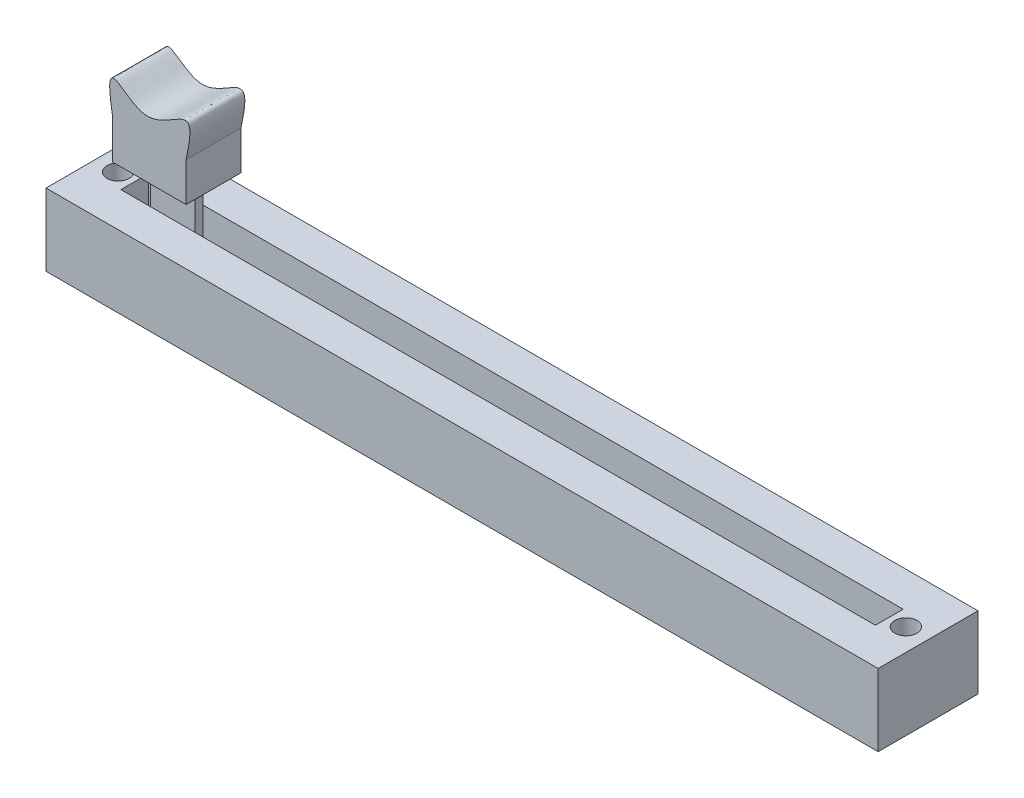
ISO-10303-21;
HEADER;
FILE_DESCRIPTION(('STEP AP214'),'2;1');
FILE_NAME('part.step','',(''),(''),'','','');
FILE_SCHEMA(('AUTOMOTIVE_DESIGN { 1 0 10303 214 1 1 1 1 }'));
ENDSEC;
DATA;
#1=APPLICATION_CONTEXT('core data for automotive mechanical design processes');
#2=APPLICATION_PROTOCOL_DEFINITION('international standard','automotive_design',2000,#1);
#3=PRODUCT_CONTEXT('',#1,'mechanical');
#4=PRODUCT('Part','Part','',(#3));
#5=PRODUCT_RELATED_PRODUCT_CATEGORY('part','',(#4));
#6=PRODUCT_DEFINITION_FORMATION('','',#4);
#7=PRODUCT_DEFINITION_CONTEXT('part definition',#1,'design');
#8=PRODUCT_DEFINITION('design','',#6,#7);
#9=PRODUCT_DEFINITION_SHAPE('','',#8);
#10=(LENGTH_UNIT() NAMED_UNIT(*) SI_UNIT(.MILLI.,.METRE.));
#11=(NAMED_UNIT(*) PLANE_ANGLE_UNIT() SI_UNIT($,.RADIAN.));
#12=(NAMED_UNIT(*) SI_UNIT($,.STERADIAN.) SOLID_ANGLE_UNIT());
#13=UNCERTAINTY_MEASURE_WITH_UNIT(LENGTH_MEASURE(1.E-05),#10,'distance_accuracy_value','');
#14=(GEOMETRIC_REPRESENTATION_CONTEXT(3) GLOBAL_UNCERTAINTY_ASSIGNED_CONTEXT((#13)) GLOBAL_UNIT_ASSIGNED_CONTEXT((#10,
#11,#12)) REPRESENTATION_CONTEXT('',''));
#15=CARTESIAN_POINT('',(0.,0.,0.));
#16=DIRECTION('',(0.,0.,1.));
#17=DIRECTION('',(1.,0.,0.));
#18=AXIS2_PLACEMENT_3D('',#15,#16,#17);
#19=CARTESIAN_POINT('',(-33.5207521696573,9.5,0.));
#20=DIRECTION('',(1.,0.,0.));
#21=DIRECTION('',(0.,0.,-1.));
#22=AXIS2_PLACEMENT_3D('',#19,#20,#21);
#23=PLANE('',#22);
#24=DIRECTION('',(0.,1.,0.));
#25=VECTOR('',#24,1.);
#26=CARTESIAN_POINT('',(-33.5207521696573,9.5,2.47426588466461));
#27=LINE('',#26,#25);
#28=CARTESIAN_POINT('',(-33.5207521696573,9.5,2.47426588466461));
#29=VERTEX_POINT('',#28);
#30=CARTESIAN_POINT('',(-33.5207521696573,13.,2.47426588466461));
#31=VERTEX_POINT('',#30);
#32=EDGE_CURVE('E13',#29,#31,#27,.T.);
#33=ORIENTED_EDGE('',*,*,#32,.T.);
#34=DIRECTION('',(0.,0.,-1.));
#35=VECTOR('',#34,1.);
#36=CARTESIAN_POINT('',(-33.5207521696573,13.,0.));
#37=LINE('',#36,#35);
#38=CARTESIAN_POINT('',(-33.5207521696573,13.,-2.47426588466461));
#39=VERTEX_POINT('',#38);
#40=EDGE_CURVE('E140',#31,#39,#37,.T.);
#41=ORIENTED_EDGE('',*,*,#40,.T.);
#42=DIRECTION('',(0.,1.,0.));
#43=VECTOR('',#42,1.);
#44=CARTESIAN_POINT('',(-33.5207521696573,9.5,-2.47426588466461));
#45=LINE('',#44,#43);
#46=CARTESIAN_POINT('',(-33.5207521696573,9.5,-2.47426588466461));
#47=VERTEX_POINT('',#46);
#48=EDGE_CURVE('E106',#47,#39,#45,.T.);
#49=ORIENTED_EDGE('',*,*,#48,.F.);
#50=DIRECTION('',(0.,0.,-1.));
#51=VECTOR('',#50,1.);
#52=CARTESIAN_POINT('',(-33.5207521696573,9.5,0.));
#53=LINE('',#52,#51);
#54=EDGE_CURVE('E153',#29,#47,#53,.T.);
#55=ORIENTED_EDGE('',*,*,#54,.F.);
#56=EDGE_LOOP('',(#33,#41,#49,#55));
#57=FACE_BOUND('',#56,.T.);
#58=ADVANCED_FACE('F97',(#57),#23,.F.);
#59=CARTESIAN_POINT('',(0.,9.5,-2.47426588466461));
#60=DIRECTION('',(0.,0.,1.));
#61=DIRECTION('',(1.,0.,0.));
#62=AXIS2_PLACEMENT_3D('',#59,#60,#61);
#63=PLANE('',#62);
#64=ORIENTED_EDGE('',*,*,#48,.T.);
#65=CARTESIAN_POINT('',(-26.8995090885313,13.,-2.47426588466461));
#66=CARTESIAN_POINT('',(-25.6043212619655,18.7745663821567,-2.47426588466461));
#67=CARTESIAN_POINT('',(-30.5232119514642,10.6110358243155,-2.47426588466461));
#68=CARTESIAN_POINT('',(-34.4964256333982,18.6414033601117,-2.47426588466461));
#69=CARTESIAN_POINT('',(-33.5207521696573,13.,-2.47426588466461));
#70=B_SPLINE_CURVE_WITH_KNOTS('',3,(#65,#66,#67,#68,#69),.UNSPECIFIED.,.F.,.F.,(4,1,4),(0.,
0.526384960024417,1.),.UNSPECIFIED.);
#71=CARTESIAN_POINT('',(-26.8995090885313,13.,-2.47426588466461));
#72=VERTEX_POINT('',#71);
#73=EDGE_CURVE('E145',#39,#72,#70,.F.);
#74=ORIENTED_EDGE('',*,*,#73,.T.);
#75=DIRECTION('',(0.,1.,0.));
#76=VECTOR('',#75,1.);
#77=CARTESIAN_POINT('',(-26.8995090885313,9.5,-2.47426588466461));
#78=LINE('',#77,#76);
#79=CARTESIAN_POINT('',(-26.8995090885313,9.5,-2.47426588466461));
#80=VERTEX_POINT('',#79);
#81=EDGE_CURVE('E166',#80,#72,#78,.T.);
#82=ORIENTED_EDGE('',*,*,#81,.F.);
#83=DIRECTION('',(1.,0.,0.));
#84=VECTOR('',#83,1.);
#85=CARTESIAN_POINT('',(0.,9.5,-2.47426588466461));
#86=LINE('',#85,#84);
#87=EDGE_CURVE('E120',#47,#80,#86,.T.);
#88=ORIENTED_EDGE('',*,*,#87,.F.);
#89=EDGE_LOOP('',(#64,#74,#82,#88));
#90=FACE_BOUND('',#89,.T.);
#91=ADVANCED_FACE('F170',(#90),#63,.F.);
#92=CARTESIAN_POINT('',(-26.8995090885313,9.5,0.));
#93=DIRECTION('',(1.,0.,0.));
#94=DIRECTION('',(0.,0.,-1.));
#95=AXIS2_PLACEMENT_3D('',#92,#93,#94);
#96=PLANE('',#95);
#97=ORIENTED_EDGE('',*,*,#81,.T.);
#98=DIRECTION('',(0.,0.,-1.));
#99=VECTOR('',#98,1.);
#100=CARTESIAN_POINT('',(-26.8995090885313,13.,0.));
#101=LINE('',#100,#99);
#102=CARTESIAN_POINT('',(-26.8995090885313,13.,2.47426588466461));
#103=VERTEX_POINT('',#102);
#104=EDGE_CURVE('E149',#103,#72,#101,.T.);
#105=ORIENTED_EDGE('',*,*,#104,.F.);
#106=DIRECTION('',(0.,1.,0.));
#107=VECTOR('',#106,1.);
#108=CARTESIAN_POINT('',(-26.8995090885313,9.5,2.47426588466461));
#109=LINE('',#108,#107);
#110=CARTESIAN_POINT('',(-26.8995090885313,9.5,2.47426588466461));
#111=VERTEX_POINT('',#110);
#112=EDGE_CURVE('E101',#111,#103,#109,.T.);
#113=ORIENTED_EDGE('',*,*,#112,.F.);
#114=DIRECTION('',(0.,0.,-1.));
#115=VECTOR('',#114,1.);
#116=CARTESIAN_POINT('',(-26.8995090885313,9.5,0.));
#117=LINE('',#116,#115);
#118=EDGE_CURVE('E160',#111,#80,#117,.T.);
#119=ORIENTED_EDGE('',*,*,#118,.T.);
#120=EDGE_LOOP('',(#97,#105,#113,#119));
#121=FACE_BOUND('',#120,.T.);
#122=ADVANCED_FACE('F169',(#121),#96,.T.);
#123=CARTESIAN_POINT('',(0.,9.5,2.47426588466461));
#124=DIRECTION('',(0.,0.,1.));
#125=DIRECTION('',(1.,0.,0.));
#126=AXIS2_PLACEMENT_3D('',#123,#124,#125);
#127=PLANE('',#126);
#128=ORIENTED_EDGE('',*,*,#112,.T.);
#129=CARTESIAN_POINT('',(-26.8995090885313,13.,2.47426588466461));
#130=CARTESIAN_POINT('',(-25.6043212619655,18.7745663821567,2.47426588466461));
#131=CARTESIAN_POINT('',(-30.5232119514642,10.6110358243155,2.47426588466461));
#132=CARTESIAN_POINT('',(-34.4964256333982,18.6414033601117,2.47426588466461));
#133=CARTESIAN_POINT('',(-33.5207521696573,13.,2.47426588466461));
#134=B_SPLINE_CURVE_WITH_KNOTS('',3,(#129,#130,#131,#132,#133),.UNSPECIFIED.,.F.,.F.,(4,1,4),
(0.,0.526384960024417,1.),.UNSPECIFIED.);
#135=EDGE_CURVE('E142',#103,#31,#134,.T.);
#136=ORIENTED_EDGE('',*,*,#135,.T.);
#137=ORIENTED_EDGE('',*,*,#32,.F.);
#138=DIRECTION('',(1.,0.,0.));
#139=VECTOR('',#138,1.);
#140=CARTESIAN_POINT('',(0.,9.5,2.47426588466461));
#141=LINE('',#140,#139);
#142=EDGE_CURVE('E148',#29,#111,#141,.T.);
#143=ORIENTED_EDGE('',*,*,#142,.T.);
#144=EDGE_LOOP('',(#128,#136,#137,#143));
#145=FACE_BOUND('',#144,.T.);
#146=ADVANCED_FACE('F99',(#145),#127,.T.);
#147=CARTESIAN_POINT('',(0.,9.5,0.));
#148=DIRECTION('',(0.,1.,0.));
#149=DIRECTION('',(0.,0.,1.));
#150=AXIS2_PLACEMENT_3D('',#147,#148,#149);
#151=PLANE('',#150);
#152=ORIENTED_EDGE('',*,*,#142,.F.);
#153=ORIENTED_EDGE('',*,*,#54,.T.);
#154=ORIENTED_EDGE('',*,*,#87,.T.);
#155=ORIENTED_EDGE('',*,*,#118,.F.);
#156=EDGE_LOOP('',(#152,#153,#154,#155));
#157=FACE_BOUND('',#156,.T.);
#158=ADVANCED_FACE('F158',(#157),#151,.F.);
#159=CARTESIAN_POINT('',(-26.8995090885313,13.,-12.7765696506724));
#160=CARTESIAN_POINT('',(-25.6043212619655,18.7745663821567,-12.7765696506724));
#161=CARTESIAN_POINT('',(-30.5232119514642,10.6110358243155,-12.7765696506724));
#162=CARTESIAN_POINT('',(-34.4964256333982,18.6414033601117,-12.7765696506724));
#163=CARTESIAN_POINT('',(-33.5207521696573,13.,-12.7765696506724));
#164=B_SPLINE_CURVE_WITH_KNOTS('',3,(#159,#160,#161,#162,#163),.UNSPECIFIED.,.F.,.F.,(4,1,4),
(0.,0.526384960024417,1.),.UNSPECIFIED.);
#165=DIRECTION('',(0.,0.,1.));
#166=VECTOR('',#165,1.);
#167=SURFACE_OF_LINEAR_EXTRUSION('',#164,#166);
#168=ORIENTED_EDGE('',*,*,#73,.F.);
#169=ORIENTED_EDGE('',*,*,#40,.F.);
#170=ORIENTED_EDGE('',*,*,#135,.F.);
#171=ORIENTED_EDGE('',*,*,#104,.T.);
#172=EDGE_LOOP('',(#168,#169,#170,#171));
#173=FACE_BOUND('',#172,.T.);
#174=ADVANCED_FACE('F141',(#173),#167,.T.);
#175=CLOSED_SHELL('',(#58,#91,#122,#146,#158,#174));
#176=MANIFOLD_SOLID_BREP('B2',#175);
#177=CARTESIAN_POINT('',(-28.2101306290943,12.5,0.367706448700696));
#178=DIRECTION('',(-1.,0.,0.));
#179=DIRECTION('',(0.,0.,1.));
#180=AXIS2_PLACEMENT_3D('',#177,#178,#179);
#181=PLANE('',#180);
#182=DIRECTION('',(0.,0.,-1.));
#183=VECTOR('',#182,1.);
#184=CARTESIAN_POINT('',(-28.2101306290943,2.,0.367706448700696));
#185=LINE('',#184,#183);
#186=CARTESIAN_POINT('',(-28.2101306290943,2.,0.367706448700696));
#187=VERTEX_POINT('',#186);
#188=CARTESIAN_POINT('',(-28.2101306290943,2.,-0.367706448700696));
#189=VERTEX_POINT('',#188);
#190=EDGE_CURVE('E318',#187,#189,#185,.T.);
#191=ORIENTED_EDGE('',*,*,#190,.T.);
#192=DIRECTION('',(0.,-1.,0.));
#193=VECTOR('',#192,1.);
#194=CARTESIAN_POINT('',(-28.2101306290943,12.5,-0.367706448700696));
#195=LINE('',#194,#193);
#196=CARTESIAN_POINT('',(-28.2101306290943,12.5,-0.367706448700696));
#197=VERTEX_POINT('',#196);
#198=EDGE_CURVE('E95',#197,#189,#195,.T.);
#199=ORIENTED_EDGE('',*,*,#198,.F.);
#200=DIRECTION('',(0.,0.,-1.));
#201=VECTOR('',#200,1.);
#202=CARTESIAN_POINT('',(-28.2101306290943,12.5,0.367706448700696));
#203=LINE('',#202,#201);
#204=CARTESIAN_POINT('',(-28.2101306290943,12.5,0.367706448700696));
#205=VERTEX_POINT('',#204);
#206=EDGE_CURVE('E306',#205,#197,#203,.T.);
#207=ORIENTED_EDGE('',*,*,#206,.F.);
#208=DIRECTION('',(0.,-1.,0.));
#209=VECTOR('',#208,1.);
#210=CARTESIAN_POINT('',(-28.2101306290943,12.5,0.367706448700696));
#211=LINE('',#210,#209);
#212=EDGE_CURVE('E314',#205,#187,#211,.T.);
#213=ORIENTED_EDGE('',*,*,#212,.T.);
#214=EDGE_LOOP('',(#191,#199,#207,#213));
#215=FACE_BOUND('',#214,.T.);
#216=ADVANCED_FACE('F255',(#215),#181,.F.);
#217=CARTESIAN_POINT('',(-32.2101306290943,12.5,-0.367706448700696));
#218=DIRECTION('',(0.,0.,1.));
#219=DIRECTION('',(1.,0.,0.));
#220=AXIS2_PLACEMENT_3D('',#217,#218,#219);
#221=PLANE('',#220);
#222=DIRECTION('',(-1.,0.,0.));
#223=VECTOR('',#222,1.);
#224=CARTESIAN_POINT('',(-32.2101306290943,2.,-0.367706448700696));
#225=LINE('',#224,#223);
#226=CARTESIAN_POINT('',(-32.2101306290943,2.,-0.367706448700696));
#227=VERTEX_POINT('',#226);
#228=EDGE_CURVE('E310',#189,#227,#225,.T.);
#229=ORIENTED_EDGE('',*,*,#228,.T.);
#230=DIRECTION('',(0.,-1.,0.));
#231=VECTOR('',#230,1.);
#232=CARTESIAN_POINT('',(-32.2101306290943,12.5,-0.367706448700696));
#233=LINE('',#232,#231);
#234=CARTESIAN_POINT('',(-32.2101306290943,12.5,-0.367706448700696));
#235=VERTEX_POINT('',#234);
#236=EDGE_CURVE('E263',#235,#227,#233,.T.);
#237=ORIENTED_EDGE('',*,*,#236,.F.);
#238=DIRECTION('',(-1.,0.,0.));
#239=VECTOR('',#238,1.);
#240=CARTESIAN_POINT('',(-32.2101306290943,12.5,-0.367706448700696));
#241=LINE('',#240,#239);
#242=EDGE_CURVE('E301',#197,#235,#241,.T.);
#243=ORIENTED_EDGE('',*,*,#242,.F.);
#244=ORIENTED_EDGE('',*,*,#198,.T.);
#245=EDGE_LOOP('',(#229,#237,#243,#244));
#246=FACE_BOUND('',#245,.T.);
#247=ADVANCED_FACE('F309',(#246),#221,.F.);
#248=CARTESIAN_POINT('',(-32.2101306290943,12.5,0.367706448700696));
#249=DIRECTION('',(1.,0.,0.));
#250=DIRECTION('',(0.,0.,-1.));
#251=AXIS2_PLACEMENT_3D('',#248,#249,#250);
#252=PLANE('',#251);
#253=DIRECTION('',(0.,0.,1.));
#254=VECTOR('',#253,1.);
#255=CARTESIAN_POINT('',(-32.2101306290943,2.,0.367706448700696));
#256=LINE('',#255,#254);
#257=CARTESIAN_POINT('',(-32.2101306290943,2.,0.367706448700696));
#258=VERTEX_POINT('',#257);
#259=EDGE_CURVE('E288',#227,#258,#256,.T.);
#260=ORIENTED_EDGE('',*,*,#259,.T.);
#261=DIRECTION('',(0.,-1.,0.));
#262=VECTOR('',#261,1.);
#263=CARTESIAN_POINT('',(-32.2101306290943,12.5,0.367706448700696));
#264=LINE('',#263,#262);
#265=CARTESIAN_POINT('',(-32.2101306290943,12.5,0.367706448700696));
#266=VERTEX_POINT('',#265);
#267=EDGE_CURVE('E311',#266,#258,#264,.T.);
#268=ORIENTED_EDGE('',*,*,#267,.F.);
#269=DIRECTION('',(0.,0.,1.));
#270=VECTOR('',#269,1.);
#271=CARTESIAN_POINT('',(-32.2101306290943,12.5,0.367706448700696));
#272=LINE('',#271,#270);
#273=EDGE_CURVE('E304',#235,#266,#272,.T.);
#274=ORIENTED_EDGE('',*,*,#273,.F.);
#275=ORIENTED_EDGE('',*,*,#236,.T.);
#276=EDGE_LOOP('',(#260,#268,#274,#275));
#277=FACE_BOUND('',#276,.T.);
#278=ADVANCED_FACE('F312',(#277),#252,.F.);
#279=CARTESIAN_POINT('',(-32.2101306290943,12.5,0.367706448700696));
#280=DIRECTION('',(0.,0.,-1.));
#281=DIRECTION('',(-1.,0.,0.));
#282=AXIS2_PLACEMENT_3D('',#279,#280,#281);
#283=PLANE('',#282);
#284=DIRECTION('',(1.,0.,0.));
#285=VECTOR('',#284,1.);
#286=CARTESIAN_POINT('',(-32.2101306290943,2.,0.367706448700696));
#287=LINE('',#286,#285);
#288=EDGE_CURVE('E294',#258,#187,#287,.T.);
#289=ORIENTED_EDGE('',*,*,#288,.T.);
#290=ORIENTED_EDGE('',*,*,#212,.F.);
#291=DIRECTION('',(1.,0.,0.));
#292=VECTOR('',#291,1.);
#293=CARTESIAN_POINT('',(-32.2101306290943,12.5,0.367706448700696));
#294=LINE('',#293,#292);
#295=EDGE_CURVE('E271',#266,#205,#294,.T.);
#296=ORIENTED_EDGE('',*,*,#295,.F.);
#297=ORIENTED_EDGE('',*,*,#267,.T.);
#298=EDGE_LOOP('',(#289,#290,#296,#297));
#299=FACE_BOUND('',#298,.T.);
#300=ADVANCED_FACE('F325',(#299),#283,.F.);
#301=CARTESIAN_POINT('',(0.,12.5,0.));
#302=DIRECTION('',(0.,-1.,0.));
#303=DIRECTION('',(0.,0.,-1.));
#304=AXIS2_PLACEMENT_3D('',#301,#302,#303);
#305=PLANE('',#304);
#306=ORIENTED_EDGE('',*,*,#206,.T.);
#307=ORIENTED_EDGE('',*,*,#242,.T.);
#308=ORIENTED_EDGE('',*,*,#273,.T.);
#309=ORIENTED_EDGE('',*,*,#295,.T.);
#310=EDGE_LOOP('',(#306,#307,#308,#309));
#311=FACE_BOUND('',#310,.T.);
#312=ADVANCED_FACE('F302',(#311),#305,.F.);
#313=CARTESIAN_POINT('',(0.,2.,0.));
#314=DIRECTION('',(0.,-1.,0.));
#315=DIRECTION('',(0.,0.,-1.));
#316=AXIS2_PLACEMENT_3D('',#313,#314,#315);
#317=PLANE('',#316);
#318=ORIENTED_EDGE('',*,*,#190,.F.);
#319=ORIENTED_EDGE('',*,*,#288,.F.);
#320=ORIENTED_EDGE('',*,*,#259,.F.);
#321=ORIENTED_EDGE('',*,*,#228,.F.);
#322=EDGE_LOOP('',(#318,#319,#320,#321));
#323=FACE_BOUND('',#322,.T.);
#324=ADVANCED_FACE('F328',(#323),#317,.T.);
#325=CLOSED_SHELL('',(#216,#247,#278,#300,#312,#324));
#326=MANIFOLD_SOLID_BREP('B7',#325);
#327=CARTESIAN_POINT('',(0.,6.5,0.));
#328=DIRECTION('',(0.,1.,0.));
#329=DIRECTION('',(0.,0.,1.));
#330=AXIS2_PLACEMENT_3D('',#327,#328,#329);
#331=PLANE('',#330);
#332=CARTESIAN_POINT('',(35.5,6.5,0.));
#333=DIRECTION('',(0.,1.,0.));
#334=DIRECTION('',(0.,0.,1.));
#335=AXIS2_PLACEMENT_3D('',#332,#333,#334);
#336=CIRCLE('',#335,0.999999999999998);
#337=CARTESIAN_POINT('',(35.5,6.5,-0.999999999999998));
#338=VERTEX_POINT('',#337);
#339=EDGE_CURVE('E483',#338,#338,#336,.T.);
#340=ORIENTED_EDGE('',*,*,#339,.F.);
#341=EDGE_LOOP('',(#340));
#342=FACE_BOUND('',#341,.T.);
#343=CARTESIAN_POINT('',(-35.5,6.5,0.));
#344=DIRECTION('',(0.,1.,0.));
#345=DIRECTION('',(0.,0.,1.));
#346=AXIS2_PLACEMENT_3D('',#343,#344,#345);
#347=CIRCLE('',#346,0.999999999999998);
#348=CARTESIAN_POINT('',(-35.5,6.5,-0.999999999999998));
#349=VERTEX_POINT('',#348);
#350=EDGE_CURVE('E486',#349,#349,#347,.T.);
#351=ORIENTED_EDGE('',*,*,#350,.F.);
#352=EDGE_LOOP('',(#351));
#353=FACE_BOUND('',#352,.T.);
#354=DIRECTION('',(1.,0.,0.));
#355=VECTOR('',#354,1.);
#356=CARTESIAN_POINT('',(0.,6.5,4.5));
#357=LINE('',#356,#355);
#358=CARTESIAN_POINT('',(-37.5,6.5,4.5));
#359=VERTEX_POINT('',#358);
#360=CARTESIAN_POINT('',(37.5,6.5,4.5));
#361=VERTEX_POINT('',#360);
#362=EDGE_CURVE('E490',#359,#361,#357,.T.);
#363=ORIENTED_EDGE('',*,*,#362,.T.);
#364=DIRECTION('',(0.,0.,-1.));
#365=VECTOR('',#364,1.);
#366=CARTESIAN_POINT('',(37.5,6.5,0.));
#367=LINE('',#366,#365);
#368=CARTESIAN_POINT('',(37.5,6.5,-4.5));
#369=VERTEX_POINT('',#368);
#370=EDGE_CURVE('E429',#361,#369,#367,.T.);
#371=ORIENTED_EDGE('',*,*,#370,.T.);
#372=DIRECTION('',(1.,0.,0.));
#373=VECTOR('',#372,1.);
#374=CARTESIAN_POINT('',(0.,6.5,-4.5));
#375=LINE('',#374,#373);
#376=CARTESIAN_POINT('',(-37.5,6.5,-4.5));
#377=VERTEX_POINT('',#376);
#378=EDGE_CURVE('E493',#377,#369,#375,.T.);
#379=ORIENTED_EDGE('',*,*,#378,.F.);
#380=DIRECTION('',(0.,0.,-1.));
#381=VECTOR('',#380,1.);
#382=CARTESIAN_POINT('',(-37.5,6.5,0.));
#383=LINE('',#382,#381);
#384=EDGE_CURVE('E496',#359,#377,#383,.T.);
#385=ORIENTED_EDGE('',*,*,#384,.F.);
#386=EDGE_LOOP('',(#363,#371,#379,#385));
#387=FACE_BOUND('',#386,.T.);
#388=DIRECTION('',(1.,0.,0.));
#389=VECTOR('',#388,1.);
#390=CARTESIAN_POINT('',(0.,6.5,-1.25));
#391=LINE('',#390,#389);
#392=CARTESIAN_POINT('',(-34.,6.5,-1.25));
#393=VERTEX_POINT('',#392);
#394=CARTESIAN_POINT('',(34.,6.5,-1.25000000000001));
#395=VERTEX_POINT('',#394);
#396=EDGE_CURVE('E386',#393,#395,#391,.T.);
#397=ORIENTED_EDGE('',*,*,#396,.T.);
#398=DIRECTION('',(0.,0.,1.));
#399=VECTOR('',#398,1.);
#400=CARTESIAN_POINT('',(34.,6.5,0.));
#401=LINE('',#400,#399);
#402=CARTESIAN_POINT('',(34.,6.5,1.24999999999999));
#403=VERTEX_POINT('',#402);
#404=EDGE_CURVE('E253',#395,#403,#401,.T.);
#405=ORIENTED_EDGE('',*,*,#404,.T.);
#406=DIRECTION('',(1.,0.,0.));
#407=VECTOR('',#406,1.);
#408=CARTESIAN_POINT('',(0.,6.5,1.25));
#409=LINE('',#408,#407);
#410=CARTESIAN_POINT('',(-34.,6.5,1.25));
#411=VERTEX_POINT('',#410);
#412=EDGE_CURVE('E520',#411,#403,#409,.T.);
#413=ORIENTED_EDGE('',*,*,#412,.F.);
#414=DIRECTION('',(0.,0.,1.));
#415=VECTOR('',#414,1.);
#416=CARTESIAN_POINT('',(-34.,6.5,0.));
#417=LINE('',#416,#415);
#418=EDGE_CURVE('E522',#393,#411,#417,.T.);
#419=ORIENTED_EDGE('',*,*,#418,.F.);
#420=EDGE_LOOP('',(#397,#405,#413,#419));
#421=FACE_BOUND('',#420,.T.);
#422=ADVANCED_FACE('F378',(#342,#353,#387,#421),#331,.T.);
#423=CARTESIAN_POINT('',(0.,6.5,4.5));
#424=DIRECTION('',(0.,0.,-1.));
#425=DIRECTION('',(-1.,0.,0.));
#426=AXIS2_PLACEMENT_3D('',#423,#424,#425);
#427=PLANE('',#426);
#428=DIRECTION('',(1.,0.,0.));
#429=VECTOR('',#428,1.);
#430=CARTESIAN_POINT('',(0.,0.,4.5));
#431=LINE('',#430,#429);
#432=CARTESIAN_POINT('',(-37.5,0.,4.5));
#433=VERTEX_POINT('',#432);
#434=CARTESIAN_POINT('',(37.5,0.,4.5));
#435=VERTEX_POINT('',#434);
#436=EDGE_CURVE('E503',#433,#435,#431,.T.);
#437=ORIENTED_EDGE('',*,*,#436,.T.);
#438=DIRECTION('',(0.,-1.,0.));
#439=VECTOR('',#438,1.);
#440=CARTESIAN_POINT('',(37.5,6.5,4.5));
#441=LINE('',#440,#439);
#442=EDGE_CURVE('E518',#361,#435,#441,.T.);
#443=ORIENTED_EDGE('',*,*,#442,.F.);
#444=ORIENTED_EDGE('',*,*,#362,.F.);
#445=DIRECTION('',(0.,-1.,0.));
#446=VECTOR('',#445,1.);
#447=CARTESIAN_POINT('',(-37.5,6.5,4.5));
#448=LINE('',#447,#446);
#449=EDGE_CURVE('E402',#359,#433,#448,.T.);
#450=ORIENTED_EDGE('',*,*,#449,.T.);
#451=EDGE_LOOP('',(#437,#443,#444,#450));
#452=FACE_BOUND('',#451,.T.);
#453=ADVANCED_FACE('F538',(#452),#427,.F.);
#454=CARTESIAN_POINT('',(37.5,6.5,0.));
#455=DIRECTION('',(-1.,0.,0.));
#456=DIRECTION('',(0.,0.,1.));
#457=AXIS2_PLACEMENT_3D('',#454,#455,#456);
#458=PLANE('',#457);
#459=DIRECTION('',(0.,0.,-1.));
#460=VECTOR('',#459,1.);
#461=CARTESIAN_POINT('',(37.5,0.,0.));
#462=LINE('',#461,#460);
#463=CARTESIAN_POINT('',(37.5,0.,-4.5));
#464=VERTEX_POINT('',#463);
#465=EDGE_CURVE('E505',#435,#464,#462,.T.);
#466=ORIENTED_EDGE('',*,*,#465,.T.);
#467=DIRECTION('',(0.,-1.,0.));
#468=VECTOR('',#467,1.);
#469=CARTESIAN_POINT('',(37.5,6.5,-4.5));
#470=LINE('',#469,#468);
#471=EDGE_CURVE('E516',#369,#464,#470,.T.);
#472=ORIENTED_EDGE('',*,*,#471,.F.);
#473=ORIENTED_EDGE('',*,*,#370,.F.);
#474=ORIENTED_EDGE('',*,*,#442,.T.);
#475=EDGE_LOOP('',(#466,#472,#473,#474));
#476=FACE_BOUND('',#475,.T.);
#477=ADVANCED_FACE('F544',(#476),#458,.F.);
#478=CARTESIAN_POINT('',(0.,6.5,-4.5));
#479=DIRECTION('',(0.,0.,-1.));
#480=DIRECTION('',(-1.,0.,0.));
#481=AXIS2_PLACEMENT_3D('',#478,#479,#480);
#482=PLANE('',#481);
#483=DIRECTION('',(1.,0.,0.));
#484=VECTOR('',#483,1.);
#485=CARTESIAN_POINT('',(0.,0.,-4.5));
#486=LINE('',#485,#484);
#487=CARTESIAN_POINT('',(-37.5,0.,-4.5));
#488=VERTEX_POINT('',#487);
#489=EDGE_CURVE('E508',#488,#464,#486,.T.);
#490=ORIENTED_EDGE('',*,*,#489,.F.);
#491=DIRECTION('',(0.,-1.,0.));
#492=VECTOR('',#491,1.);
#493=CARTESIAN_POINT('',(-37.5,6.5,-4.5));
#494=LINE('',#493,#492);
#495=EDGE_CURVE('E514',#377,#488,#494,.T.);
#496=ORIENTED_EDGE('',*,*,#495,.F.);
#497=ORIENTED_EDGE('',*,*,#378,.T.);
#498=ORIENTED_EDGE('',*,*,#471,.T.);
#499=EDGE_LOOP('',(#490,#496,#497,#498));
#500=FACE_BOUND('',#499,.T.);
#501=ADVANCED_FACE('F558',(#500),#482,.T.);
#502=CARTESIAN_POINT('',(-35.5,6.5,0.));
#503=DIRECTION('',(0.,-1.,0.));
#504=DIRECTION('',(0.,0.,-1.));
#505=AXIS2_PLACEMENT_3D('',#502,#503,#504);
#506=CYLINDRICAL_SURFACE('',#505,0.999999999999998);
#507=CARTESIAN_POINT('',(-35.5,0.,0.));
#508=DIRECTION('',(0.,1.,0.));
#509=DIRECTION('',(0.,0.,1.));
#510=AXIS2_PLACEMENT_3D('',#507,#508,#509);
#511=CIRCLE('',#510,0.999999999999998);
#512=CARTESIAN_POINT('',(-35.5,0.,-0.999999999999998));
#513=VERTEX_POINT('',#512);
#514=EDGE_CURVE('E500',#513,#513,#511,.T.);
#515=CARTESIAN_POINT('',(-35.5,6.5,-0.999999999999998));
#516=CARTESIAN_POINT('',(-35.5,6.43229166666667,-0.999999999999998));
#517=CARTESIAN_POINT('',(-35.5,6.36458333333333,-0.999999999999998));
#518=CARTESIAN_POINT('',(-35.5,6.22916666666667,-0.999999999999998));
#519=CARTESIAN_POINT('',(-35.5,6.16145833333333,-0.999999999999998));
#520=CARTESIAN_POINT('',(-35.5,6.02604166666667,-0.999999999999998));
#521=CARTESIAN_POINT('',(-35.5,5.95833333333333,-0.999999999999998));
#522=CARTESIAN_POINT('',(-35.5,5.82291666666667,-0.999999999999998));
#523=CARTESIAN_POINT('',(-35.5,5.75520833333333,-0.999999999999998));
#524=CARTESIAN_POINT('',(-35.5,5.61979166666667,-0.999999999999998));
#525=CARTESIAN_POINT('',(-35.5,5.55208333333333,-0.999999999999998));
#526=CARTESIAN_POINT('',(-35.5,5.41666666666667,-0.999999999999998));
#527=CARTESIAN_POINT('',(-35.5,5.34895833333333,-0.999999999999998));
#528=CARTESIAN_POINT('',(-35.5,5.21354166666667,-0.999999999999998));
#529=CARTESIAN_POINT('',(-35.5,5.14583333333333,-0.999999999999998));
#530=CARTESIAN_POINT('',(-35.5,5.01041666666667,-0.999999999999998));
#531=CARTESIAN_POINT('',(-35.5,4.94270833333333,-0.999999999999998));
#532=CARTESIAN_POINT('',(-35.5,4.80729166666667,-0.999999999999998));
#533=CARTESIAN_POINT('',(-35.5,4.73958333333333,-0.999999999999998));
#534=CARTESIAN_POINT('',(-35.5,4.60416666666667,-0.999999999999998));
#535=CARTESIAN_POINT('',(-35.5,4.53645833333333,-0.999999999999998));
#536=CARTESIAN_POINT('',(-35.5,4.40104166666667,-0.999999999999998));
#537=CARTESIAN_POINT('',(-35.5,4.33333333333333,-0.999999999999998));
#538=CARTESIAN_POINT('',(-35.5,4.19791666666667,-0.999999999999998));
#539=CARTESIAN_POINT('',(-35.5,4.13020833333333,-0.999999999999998));
#540=CARTESIAN_POINT('',(-35.5,3.99479166666667,-0.999999999999998));
#541=CARTESIAN_POINT('',(-35.5,3.92708333333333,-0.999999999999998));
#542=CARTESIAN_POINT('',(-35.5,3.79166666666667,-0.999999999999998));
#543=CARTESIAN_POINT('',(-35.5,3.72395833333333,-0.999999999999998));
#544=CARTESIAN_POINT('',(-35.5,3.58854166666667,-0.999999999999998));
#545=CARTESIAN_POINT('',(-35.5,3.52083333333333,-0.999999999999998));
#546=CARTESIAN_POINT('',(-35.5,3.38541666666667,-0.999999999999998));
#547=CARTESIAN_POINT('',(-35.5,3.31770833333333,-0.999999999999998));
#548=CARTESIAN_POINT('',(-35.5,3.18229166666667,-0.999999999999998));
#549=CARTESIAN_POINT('',(-35.5,3.11458333333333,-0.999999999999998));
#550=CARTESIAN_POINT('',(-35.5,2.97916666666667,-0.999999999999998));
#551=CARTESIAN_POINT('',(-35.5,2.91145833333333,-0.999999999999998));
#552=CARTESIAN_POINT('',(-35.5,2.77604166666667,-0.999999999999998));
#553=CARTESIAN_POINT('',(-35.5,2.70833333333333,-0.999999999999998));
#554=CARTESIAN_POINT('',(-35.5,2.57291666666667,-0.999999999999998));
#555=CARTESIAN_POINT('',(-35.5,2.50520833333333,-0.999999999999998));
#556=CARTESIAN_POINT('',(-35.5,2.36979166666667,-0.999999999999998));
#557=CARTESIAN_POINT('',(-35.5,2.30208333333333,-0.999999999999998));
#558=CARTESIAN_POINT('',(-35.5,2.16666666666667,-0.999999999999998));
#559=CARTESIAN_POINT('',(-35.5,2.09895833333333,-0.999999999999998));
#560=CARTESIAN_POINT('',(-35.5,1.96354166666667,-0.999999999999998));
#561=CARTESIAN_POINT('',(-35.5,1.89583333333333,-0.999999999999998));
#562=CARTESIAN_POINT('',(-35.5,1.76041666666667,-0.999999999999998));
#563=CARTESIAN_POINT('',(-35.5,1.69270833333333,-0.999999999999998));
#564=CARTESIAN_POINT('',(-35.5,1.55729166666667,-0.999999999999998));
#565=CARTESIAN_POINT('',(-35.5,1.48958333333333,-0.999999999999998));
#566=CARTESIAN_POINT('',(-35.5,1.35416666666667,-0.999999999999998));
#567=CARTESIAN_POINT('',(-35.5,1.28645833333333,-0.999999999999998));
#568=CARTESIAN_POINT('',(-35.5,1.15104166666667,-0.999999999999998));
#569=CARTESIAN_POINT('',(-35.5,1.08333333333333,-0.999999999999998));
#570=CARTESIAN_POINT('',(-35.5,0.947916666666667,-0.999999999999998));
#571=CARTESIAN_POINT('',(-35.5,0.880208333333333,-0.999999999999998));
#572=CARTESIAN_POINT('',(-35.5,0.744791666666667,-0.999999999999998));
#573=CARTESIAN_POINT('',(-35.5,0.677083333333333,-0.999999999999998));
#574=CARTESIAN_POINT('',(-35.5,0.541666666666667,-0.999999999999998));
#575=CARTESIAN_POINT('',(-35.5,0.473958333333333,-0.999999999999998));
#576=CARTESIAN_POINT('',(-35.5,0.338541666666667,-0.999999999999998));
#577=CARTESIAN_POINT('',(-35.5,0.270833333333334,-0.999999999999998));
#578=CARTESIAN_POINT('',(-35.5,0.135416666666667,-0.999999999999998));
#579=CARTESIAN_POINT('',(-35.5,0.0677083333333334,-0.999999999999998));
#580=CARTESIAN_POINT('',(-35.5,0.,-0.999999999999998));
#581=B_SPLINE_CURVE_WITH_KNOTS('',3,(#515,#516,#517,#518,#519,#520,#521,#522,#523,#524,#525,
#526,#527,#528,#529,#530,#531,#532,#533,#534,#535,#536,#537,#538,#539,#540,#541,#542,#543,#544,
#545,#546,#547,#548,#549,#550,#551,#552,#553,#554,#555,#556,#557,#558,#559,#560,#561,#562,#563,
#564,#565,#566,#567,#568,#569,#570,#571,#572,#573,#574,#575,#576,#577,#578,#579,#580),
.UNSPECIFIED.,.F.,.F.,(4,2,2,2,2,2,2,2,2,2,2,2,2,2,2,2,2,2,2,2,2,2,2,2,2,2,2,2,2,2,2,2,4),(0.,
0.203125,0.40625,0.609375000000001,0.812500000000001,1.015625,1.21875,1.421875,1.625,1.828125,
2.03125,2.234375,2.4375,2.640625,2.84375,3.046875,3.25,3.453125,3.65625,3.859375,4.0625,
4.265625,4.46875,4.671875,4.875,5.078125,5.28125,5.484375,5.6875,5.890625,6.09375,6.296875,6.5),.UNSPECIFIED.);
#582=EDGE_CURVE('BSEAM561',#349,#513,#581,.T.);
#583=ORIENTED_EDGE('',*,*,#350,.T.);
#584=ORIENTED_EDGE('',*,*,#514,.F.);
#585=ORIENTED_EDGE('',*,*,#582,.T.);
#586=ORIENTED_EDGE('',*,*,#582,.F.);
#587=EDGE_LOOP('',(#583,#585,#584,#586));
#588=FACE_BOUND('',#587,.T.);
#589=ADVANCED_FACE('F561',(#588),#506,.F.);
#590=CARTESIAN_POINT('',(35.5,6.5,0.));
#591=DIRECTION('',(0.,-1.,0.));
#592=DIRECTION('',(0.,0.,-1.));
#593=AXIS2_PLACEMENT_3D('',#590,#591,#592);
#594=CYLINDRICAL_SURFACE('',#593,0.999999999999998);
#595=CARTESIAN_POINT('',(35.5,0.,0.));
#596=DIRECTION('',(0.,1.,0.));
#597=DIRECTION('',(0.,0.,1.));
#598=AXIS2_PLACEMENT_3D('',#595,#596,#597);
#599=CIRCLE('',#598,0.999999999999998);
#600=CARTESIAN_POINT('',(35.5,0.,-0.999999999999998));
#601=VERTEX_POINT('',#600);
#602=EDGE_CURVE('E461',#601,#601,#599,.T.);
#603=CARTESIAN_POINT('',(35.5,6.5,-0.999999999999998));
#604=CARTESIAN_POINT('',(35.5,6.43229166666667,-0.999999999999998));
#605=CARTESIAN_POINT('',(35.5,6.36458333333333,-0.999999999999998));
#606=CARTESIAN_POINT('',(35.5,6.22916666666667,-0.999999999999998));
#607=CARTESIAN_POINT('',(35.5,6.16145833333333,-0.999999999999998));
#608=CARTESIAN_POINT('',(35.5,6.02604166666667,-0.999999999999998));
#609=CARTESIAN_POINT('',(35.5,5.95833333333333,-0.999999999999998));
#610=CARTESIAN_POINT('',(35.5,5.82291666666667,-0.999999999999998));
#611=CARTESIAN_POINT('',(35.5,5.75520833333333,-0.999999999999998));
#612=CARTESIAN_POINT('',(35.5,5.61979166666667,-0.999999999999998));
#613=CARTESIAN_POINT('',(35.5,5.55208333333333,-0.999999999999998));
#614=CARTESIAN_POINT('',(35.5,5.41666666666667,-0.999999999999998));
#615=CARTESIAN_POINT('',(35.5,5.34895833333333,-0.999999999999998));
#616=CARTESIAN_POINT('',(35.5,5.21354166666667,-0.999999999999998));
#617=CARTESIAN_POINT('',(35.5,5.14583333333333,-0.999999999999998));
#618=CARTESIAN_POINT('',(35.5,5.01041666666667,-0.999999999999998));
#619=CARTESIAN_POINT('',(35.5,4.94270833333333,-0.999999999999998));
#620=CARTESIAN_POINT('',(35.5,4.80729166666667,-0.999999999999998));
#621=CARTESIAN_POINT('',(35.5,4.73958333333333,-0.999999999999998));
#622=CARTESIAN_POINT('',(35.5,4.60416666666667,-0.999999999999998));
#623=CARTESIAN_POINT('',(35.5,4.53645833333333,-0.999999999999998));
#624=CARTESIAN_POINT('',(35.5,4.40104166666667,-0.999999999999998));
#625=CARTESIAN_POINT('',(35.5,4.33333333333333,-0.999999999999998));
#626=CARTESIAN_POINT('',(35.5,4.19791666666667,-0.999999999999998));
#627=CARTESIAN_POINT('',(35.5,4.13020833333333,-0.999999999999998));
#628=CARTESIAN_POINT('',(35.5,3.99479166666667,-0.999999999999998));
#629=CARTESIAN_POINT('',(35.5,3.92708333333333,-0.999999999999998));
#630=CARTESIAN_POINT('',(35.5,3.79166666666667,-0.999999999999998));
#631=CARTESIAN_POINT('',(35.5,3.72395833333333,-0.999999999999998));
#632=CARTESIAN_POINT('',(35.5,3.58854166666667,-0.999999999999998));
#633=CARTESIAN_POINT('',(35.5,3.52083333333333,-0.999999999999998));
#634=CARTESIAN_POINT('',(35.5,3.38541666666667,-0.999999999999998));
#635=CARTESIAN_POINT('',(35.5,3.31770833333333,-0.999999999999998));
#636=CARTESIAN_POINT('',(35.5,3.18229166666667,-0.999999999999998));
#637=CARTESIAN_POINT('',(35.5,3.11458333333333,-0.999999999999998));
#638=CARTESIAN_POINT('',(35.5,2.97916666666667,-0.999999999999998));
#639=CARTESIAN_POINT('',(35.5,2.91145833333333,-0.999999999999998));
#640=CARTESIAN_POINT('',(35.5,2.77604166666667,-0.999999999999998));
#641=CARTESIAN_POINT('',(35.5,2.70833333333333,-0.999999999999998));
#642=CARTESIAN_POINT('',(35.5,2.57291666666667,-0.999999999999998));
#643=CARTESIAN_POINT('',(35.5,2.50520833333333,-0.999999999999998));
#644=CARTESIAN_POINT('',(35.5,2.36979166666667,-0.999999999999998));
#645=CARTESIAN_POINT('',(35.5,2.30208333333333,-0.999999999999998));
#646=CARTESIAN_POINT('',(35.5,2.16666666666667,-0.999999999999998));
#647=CARTESIAN_POINT('',(35.5,2.09895833333333,-0.999999999999998));
#648=CARTESIAN_POINT('',(35.5,1.96354166666667,-0.999999999999998));
#649=CARTESIAN_POINT('',(35.5,1.89583333333333,-0.999999999999998));
#650=CARTESIAN_POINT('',(35.5,1.76041666666667,-0.999999999999998));
#651=CARTESIAN_POINT('',(35.5,1.69270833333333,-0.999999999999998));
#652=CARTESIAN_POINT('',(35.5,1.55729166666667,-0.999999999999998));
#653=CARTESIAN_POINT('',(35.5,1.48958333333333,-0.999999999999998));
#654=CARTESIAN_POINT('',(35.5,1.35416666666667,-0.999999999999998));
#655=CARTESIAN_POINT('',(35.5,1.28645833333333,-0.999999999999998));
#656=CARTESIAN_POINT('',(35.5,1.15104166666667,-0.999999999999998));
#657=CARTESIAN_POINT('',(35.5,1.08333333333333,-0.999999999999998));
#658=CARTESIAN_POINT('',(35.5,0.947916666666667,-0.999999999999998));
#659=CARTESIAN_POINT('',(35.5,0.880208333333333,-0.999999999999998));
#660=CARTESIAN_POINT('',(35.5,0.744791666666667,-0.999999999999998));
#661=CARTESIAN_POINT('',(35.5,0.677083333333333,-0.999999999999998));
#662=CARTESIAN_POINT('',(35.5,0.541666666666667,-0.999999999999998));
#663=CARTESIAN_POINT('',(35.5,0.473958333333333,-0.999999999999998));
#664=CARTESIAN_POINT('',(35.5,0.338541666666667,-0.999999999999998));
#665=CARTESIAN_POINT('',(35.5,0.270833333333334,-0.999999999999998));
#666=CARTESIAN_POINT('',(35.5,0.135416666666667,-0.999999999999998));
#667=CARTESIAN_POINT('',(35.5,0.0677083333333334,-0.999999999999998));
#668=CARTESIAN_POINT('',(35.5,0.,-0.999999999999998));
#669=B_SPLINE_CURVE_WITH_KNOTS('',3,(#603,#604,#605,#606,#607,#608,#609,#610,#611,#612,#613,
#614,#615,#616,#617,#618,#619,#620,#621,#622,#623,#624,#625,#626,#627,#628,#629,#630,#631,#632,
#633,#634,#635,#636,#637,#638,#639,#640,#641,#642,#643,#644,#645,#646,#647,#648,#649,#650,#651,
#652,#653,#654,#655,#656,#657,#658,#659,#660,#661,#662,#663,#664,#665,#666,#667,#668),
.UNSPECIFIED.,.F.,.F.,(4,2,2,2,2,2,2,2,2,2,2,2,2,2,2,2,2,2,2,2,2,2,2,2,2,2,2,2,2,2,2,2,4),(0.,
0.203125,0.40625,0.609375000000001,0.812500000000001,1.015625,1.21875,1.421875,1.625,1.828125,
2.03125,2.234375,2.4375,2.640625,2.84375,3.046875,3.25,3.453125,3.65625,3.859375,4.0625,
4.265625,4.46875,4.671875,4.875,5.078125,5.28125,5.484375,5.6875,5.890625,6.09375,6.296875,6.5),.UNSPECIFIED.);
#670=EDGE_CURVE('BSEAM380',#338,#601,#669,.T.);
#671=ORIENTED_EDGE('',*,*,#339,.T.);
#672=ORIENTED_EDGE('',*,*,#602,.F.);
#673=ORIENTED_EDGE('',*,*,#670,.T.);
#674=ORIENTED_EDGE('',*,*,#670,.F.);
#675=EDGE_LOOP('',(#671,#673,#672,#674));
#676=FACE_BOUND('',#675,.T.);
#677=ADVANCED_FACE('F380',(#676),#594,.F.);
#678=CARTESIAN_POINT('',(-37.5,6.5,0.));
#679=DIRECTION('',(-1.,0.,0.));
#680=DIRECTION('',(0.,0.,1.));
#681=AXIS2_PLACEMENT_3D('',#678,#679,#680);
#682=PLANE('',#681);
#683=DIRECTION('',(0.,0.,-1.));
#684=VECTOR('',#683,1.);
#685=CARTESIAN_POINT('',(-37.5,0.,0.));
#686=LINE('',#685,#684);
#687=EDGE_CURVE('E487',#433,#488,#686,.T.);
#688=ORIENTED_EDGE('',*,*,#687,.F.);
#689=ORIENTED_EDGE('',*,*,#449,.F.);
#690=ORIENTED_EDGE('',*,*,#384,.T.);
#691=ORIENTED_EDGE('',*,*,#495,.T.);
#692=EDGE_LOOP('',(#688,#689,#690,#691));
#693=FACE_BOUND('',#692,.T.);
#694=ADVANCED_FACE('F554',(#693),#682,.T.);
#695=CARTESIAN_POINT('',(0.,0.,0.));
#696=DIRECTION('',(0.,1.,0.));
#697=DIRECTION('',(0.,0.,1.));
#698=AXIS2_PLACEMENT_3D('',#695,#696,#697);
#699=PLANE('',#698);
#700=ORIENTED_EDGE('',*,*,#602,.T.);
#701=EDGE_LOOP('',(#700));
#702=FACE_BOUND('',#701,.T.);
#703=ORIENTED_EDGE('',*,*,#514,.T.);
#704=EDGE_LOOP('',(#703));
#705=FACE_BOUND('',#704,.T.);
#706=ORIENTED_EDGE('',*,*,#436,.F.);
#707=ORIENTED_EDGE('',*,*,#687,.T.);
#708=ORIENTED_EDGE('',*,*,#489,.T.);
#709=ORIENTED_EDGE('',*,*,#465,.F.);
#710=EDGE_LOOP('',(#706,#707,#708,#709));
#711=FACE_BOUND('',#710,.T.);
#712=ADVANCED_FACE('F551',(#702,#705,#711),#699,.F.);
#713=CARTESIAN_POINT('',(34.,8.5,1.24999999999999));
#714=DIRECTION('',(-1.,0.,0.));
#715=DIRECTION('',(0.,0.,1.));
#716=AXIS2_PLACEMENT_3D('',#713,#714,#715);
#717=PLANE('',#716);
#718=DIRECTION('',(0.,-1.,0.));
#719=VECTOR('',#718,1.);
#720=CARTESIAN_POINT('',(34.,8.5,-1.25000000000001));
#721=LINE('',#720,#719);
#722=CARTESIAN_POINT('',(34.,2.,-1.25000000000001));
#723=VERTEX_POINT('',#722);
#724=EDGE_CURVE('E452',#395,#723,#721,.T.);
#725=ORIENTED_EDGE('',*,*,#724,.T.);
#726=DIRECTION('',(0.,0.,-1.));
#727=VECTOR('',#726,1.);
#728=CARTESIAN_POINT('',(34.,2.,1.24999999999999));
#729=LINE('',#728,#727);
#730=CARTESIAN_POINT('',(34.,2.,1.24999999999999));
#731=VERTEX_POINT('',#730);
#732=EDGE_CURVE('E457',#731,#723,#729,.T.);
#733=ORIENTED_EDGE('',*,*,#732,.F.);
#734=DIRECTION('',(0.,-1.,0.));
#735=VECTOR('',#734,1.);
#736=CARTESIAN_POINT('',(34.,8.5,1.24999999999999));
#737=LINE('',#736,#735);
#738=EDGE_CURVE('E479',#403,#731,#737,.T.);
#739=ORIENTED_EDGE('',*,*,#738,.F.);
#740=ORIENTED_EDGE('',*,*,#404,.F.);
#741=EDGE_LOOP('',(#725,#733,#739,#740));
#742=FACE_BOUND('',#741,.T.);
#743=ADVANCED_FACE('F454',(#742),#717,.T.);
#744=CARTESIAN_POINT('',(34.,8.5,-1.25000000000001));
#745=DIRECTION('',(0.,0.,1.));
#746=DIRECTION('',(1.,0.,0.));
#747=AXIS2_PLACEMENT_3D('',#744,#745,#746);
#748=PLANE('',#747);
#749=DIRECTION('',(0.,-1.,0.));
#750=VECTOR('',#749,1.);
#751=CARTESIAN_POINT('',(-34.,8.5,-1.25));
#752=LINE('',#751,#750);
#753=CARTESIAN_POINT('',(-34.,2.,-1.25));
#754=VERTEX_POINT('',#753);
#755=EDGE_CURVE('E462',#393,#754,#752,.T.);
#756=ORIENTED_EDGE('',*,*,#755,.T.);
#757=DIRECTION('',(-1.,0.,0.));
#758=VECTOR('',#757,1.);
#759=CARTESIAN_POINT('',(34.,2.,-1.25000000000001));
#760=LINE('',#759,#758);
#761=EDGE_CURVE('E465',#723,#754,#760,.T.);
#762=ORIENTED_EDGE('',*,*,#761,.F.);
#763=ORIENTED_EDGE('',*,*,#724,.F.);
#764=ORIENTED_EDGE('',*,*,#396,.F.);
#765=EDGE_LOOP('',(#756,#762,#763,#764));
#766=FACE_BOUND('',#765,.T.);
#767=ADVANCED_FACE('F466',(#766),#748,.T.);
#768=CARTESIAN_POINT('',(-34.,8.5,1.25));
#769=DIRECTION('',(-1.,0.,0.));
#770=DIRECTION('',(0.,0.,1.));
#771=AXIS2_PLACEMENT_3D('',#768,#769,#770);
#772=PLANE('',#771);
#773=ORIENTED_EDGE('',*,*,#418,.T.);
#774=DIRECTION('',(0.,-1.,0.));
#775=VECTOR('',#774,1.);
#776=CARTESIAN_POINT('',(-34.,8.5,1.25));
#777=LINE('',#776,#775);
#778=CARTESIAN_POINT('',(-34.,2.,1.25));
#779=VERTEX_POINT('',#778);
#780=EDGE_CURVE('E393',#411,#779,#777,.T.);
#781=ORIENTED_EDGE('',*,*,#780,.T.);
#782=DIRECTION('',(0.,0.,-1.));
#783=VECTOR('',#782,1.);
#784=CARTESIAN_POINT('',(-34.,2.,1.25));
#785=LINE('',#784,#783);
#786=EDGE_CURVE('E471',#779,#754,#785,.T.);
#787=ORIENTED_EDGE('',*,*,#786,.T.);
#788=ORIENTED_EDGE('',*,*,#755,.F.);
#789=EDGE_LOOP('',(#773,#781,#787,#788));
#790=FACE_BOUND('',#789,.T.);
#791=ADVANCED_FACE('F527',(#790),#772,.F.);
#792=CARTESIAN_POINT('',(34.,8.5,1.24999999999999));
#793=DIRECTION('',(0.,0.,1.));
#794=DIRECTION('',(1.,0.,0.));
#795=AXIS2_PLACEMENT_3D('',#792,#793,#794);
#796=PLANE('',#795);
#797=ORIENTED_EDGE('',*,*,#412,.T.);
#798=ORIENTED_EDGE('',*,*,#738,.T.);
#799=DIRECTION('',(-1.,0.,0.));
#800=VECTOR('',#799,1.);
#801=CARTESIAN_POINT('',(34.,2.,1.24999999999999));
#802=LINE('',#801,#800);
#803=EDGE_CURVE('E474',#731,#779,#802,.T.);
#804=ORIENTED_EDGE('',*,*,#803,.T.);
#805=ORIENTED_EDGE('',*,*,#780,.F.);
#806=EDGE_LOOP('',(#797,#798,#804,#805));
#807=FACE_BOUND('',#806,.T.);
#808=ADVANCED_FACE('F528',(#807),#796,.F.);
#809=CARTESIAN_POINT('',(0.,2.,0.));
#810=DIRECTION('',(0.,1.,0.));
#811=DIRECTION('',(0.,0.,1.));
#812=AXIS2_PLACEMENT_3D('',#809,#810,#811);
#813=PLANE('',#812);
#814=ORIENTED_EDGE('',*,*,#732,.T.);
#815=ORIENTED_EDGE('',*,*,#761,.T.);
#816=ORIENTED_EDGE('',*,*,#786,.F.);
#817=ORIENTED_EDGE('',*,*,#803,.F.);
#818=EDGE_LOOP('',(#814,#815,#816,#817));
#819=FACE_BOUND('',#818,.T.);
#820=ADVANCED_FACE('F473',(#819),#813,.T.);
#821=CLOSED_SHELL('',(#422,#453,#477,#501,#589,#677,#694,#712,#743,#767,#791,#808,#820));
#822=MANIFOLD_SOLID_BREP('B89',#821);
#823=ADVANCED_BREP_SHAPE_REPRESENTATION('',(#18,#176,#326,#822),#14);
#824=SHAPE_DEFINITION_REPRESENTATION(#9,#823);
ENDSEC;
END-ISO-10303-21;
